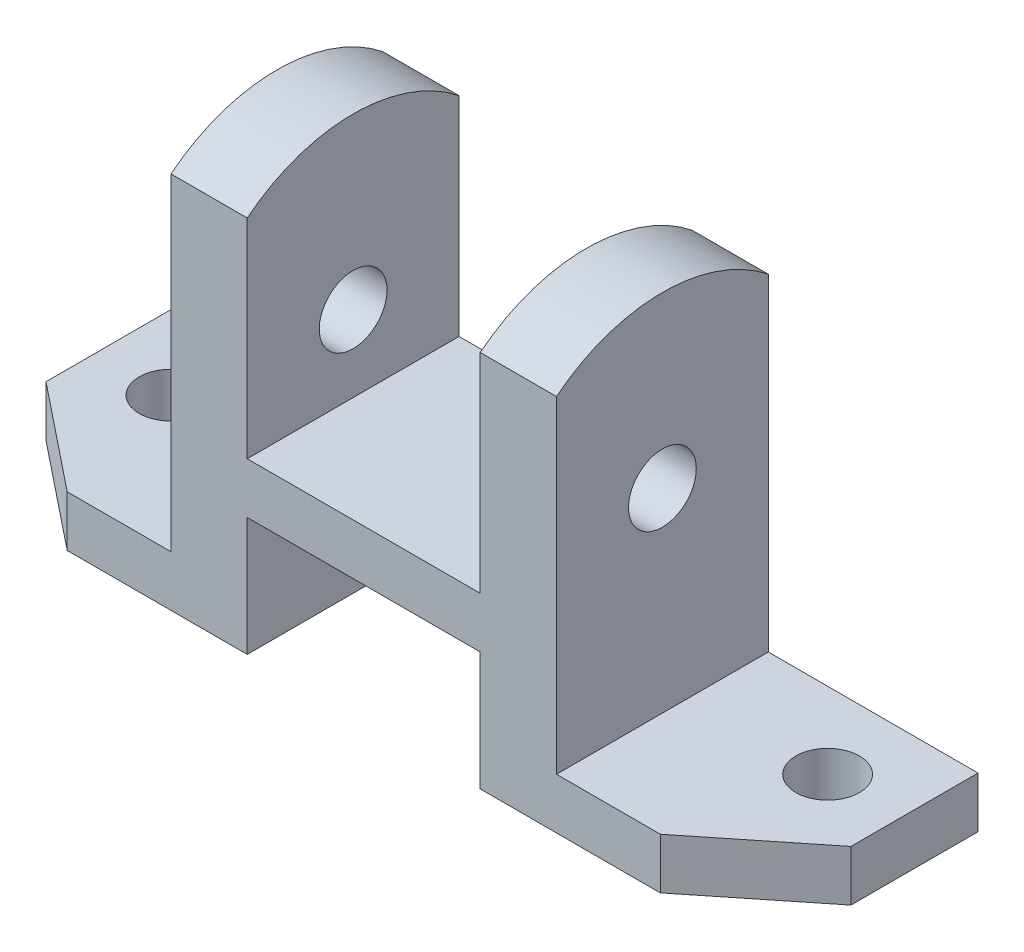
ISO-10303-21;
HEADER;
FILE_DESCRIPTION(('STEP AP214'),'2;1');
FILE_NAME('part.step','',(''),(''),'','','');
FILE_SCHEMA(('AUTOMOTIVE_DESIGN { 1 0 10303 214 1 1 1 1 }'));
ENDSEC;
DATA;
#1=APPLICATION_CONTEXT('core data for automotive mechanical design processes');
#2=APPLICATION_PROTOCOL_DEFINITION('international standard','automotive_design',2000,#1);
#3=PRODUCT_CONTEXT('',#1,'mechanical');
#4=PRODUCT('Part','Part','',(#3));
#5=PRODUCT_RELATED_PRODUCT_CATEGORY('part','',(#4));
#6=PRODUCT_DEFINITION_FORMATION('','',#4);
#7=PRODUCT_DEFINITION_CONTEXT('part definition',#1,'design');
#8=PRODUCT_DEFINITION('design','',#6,#7);
#9=PRODUCT_DEFINITION_SHAPE('','',#8);
#10=(LENGTH_UNIT() NAMED_UNIT(*) SI_UNIT(.MILLI.,.METRE.));
#11=(NAMED_UNIT(*) PLANE_ANGLE_UNIT() SI_UNIT($,.RADIAN.));
#12=(NAMED_UNIT(*) SI_UNIT($,.STERADIAN.) SOLID_ANGLE_UNIT());
#13=UNCERTAINTY_MEASURE_WITH_UNIT(LENGTH_MEASURE(1.E-05),#10,'distance_accuracy_value','');
#14=(GEOMETRIC_REPRESENTATION_CONTEXT(3) GLOBAL_UNCERTAINTY_ASSIGNED_CONTEXT((#13)) GLOBAL_UNIT_ASSIGNED_CONTEXT((#10,
#11,#12)) REPRESENTATION_CONTEXT('',''));
#15=CARTESIAN_POINT('',(0.,0.,0.));
#16=DIRECTION('',(0.,0.,1.));
#17=DIRECTION('',(1.,0.,0.));
#18=AXIS2_PLACEMENT_3D('',#15,#16,#17);
#19=CARTESIAN_POINT('',(27.5,0.,-25.));
#20=DIRECTION('',(-1.,0.,0.));
#21=DIRECTION('',(0.,-1.,0.));
#22=AXIS2_PLACEMENT_3D('',#19,#20,#21);
#23=PLANE('',#22);
#24=CARTESIAN_POINT('',(27.5,58.,0.));
#25=DIRECTION('',(-1.,0.,0.));
#26=DIRECTION('',(0.,-1.,0.));
#27=AXIS2_PLACEMENT_3D('',#24,#25,#26);
#28=CIRCLE('',#27,8.);
#29=CARTESIAN_POINT('',(27.5,50.,0.));
#30=VERTEX_POINT('',#29);
#31=EDGE_CURVE('E426',#30,#30,#28,.T.);
#32=ORIENTED_EDGE('',*,*,#31,.F.);
#33=EDGE_LOOP('',(#32));
#34=FACE_BOUND('',#33,.T.);
#35=CARTESIAN_POINT('',(27.5,58.,0.));
#36=DIRECTION('',(-1.,0.,0.));
#37=DIRECTION('',(0.,-1.,0.));
#38=AXIS2_PLACEMENT_3D('',#35,#36,#37);
#39=CIRCLE('',#38,40.);
#40=CARTESIAN_POINT('',(27.5,89.224989991992,25.));
#41=VERTEX_POINT('',#40);
#42=CARTESIAN_POINT('',(27.5,89.224989991992,-25.));
#43=VERTEX_POINT('',#42);
#44=EDGE_CURVE('E59',#41,#43,#39,.T.);
#45=ORIENTED_EDGE('',*,*,#44,.T.);
#46=DIRECTION('',(0.,-1.,0.));
#47=VECTOR('',#46,1.);
#48=CARTESIAN_POINT('',(27.5,0.,-25.));
#49=LINE('',#48,#47);
#50=CARTESIAN_POINT('',(27.5,40.,-25.));
#51=VERTEX_POINT('',#50);
#52=EDGE_CURVE('E209',#43,#51,#49,.T.);
#53=ORIENTED_EDGE('',*,*,#52,.T.);
#54=DIRECTION('',(0.,0.,1.));
#55=VECTOR('',#54,1.);
#56=CARTESIAN_POINT('',(27.5,40.,-25.));
#57=LINE('',#56,#55);
#58=CARTESIAN_POINT('',(27.5,40.,25.));
#59=VERTEX_POINT('',#58);
#60=EDGE_CURVE('E317',#51,#59,#57,.T.);
#61=ORIENTED_EDGE('',*,*,#60,.T.);
#62=DIRECTION('',(0.,-1.,0.));
#63=VECTOR('',#62,1.);
#64=CARTESIAN_POINT('',(27.5,0.,25.));
#65=LINE('',#64,#63);
#66=EDGE_CURVE('E330',#41,#59,#65,.T.);
#67=ORIENTED_EDGE('',*,*,#66,.F.);
#68=EDGE_LOOP('',(#45,#53,#61,#67));
#69=FACE_BOUND('',#68,.T.);
#70=ADVANCED_FACE('F41',(#34,#69),#23,.T.);
#71=CARTESIAN_POINT('',(-27.5,0.,-25.));
#72=DIRECTION('',(-1.,0.,0.));
#73=DIRECTION('',(0.,-1.,0.));
#74=AXIS2_PLACEMENT_3D('',#71,#72,#73);
#75=PLANE('',#74);
#76=CARTESIAN_POINT('',(-27.5,58.,0.));
#77=DIRECTION('',(-1.,0.,0.));
#78=DIRECTION('',(0.,-1.,0.));
#79=AXIS2_PLACEMENT_3D('',#76,#77,#78);
#80=CIRCLE('',#79,8.);
#81=CARTESIAN_POINT('',(-27.5,50.,0.));
#82=VERTEX_POINT('',#81);
#83=EDGE_CURVE('E429',#82,#82,#80,.T.);
#84=ORIENTED_EDGE('',*,*,#83,.T.);
#85=EDGE_LOOP('',(#84));
#86=FACE_BOUND('',#85,.T.);
#87=DIRECTION('',(0.,-1.,0.));
#88=VECTOR('',#87,1.);
#89=CARTESIAN_POINT('',(-27.5,0.,-25.));
#90=LINE('',#89,#88);
#91=CARTESIAN_POINT('',(-27.5,89.224989991992,-25.));
#92=VERTEX_POINT('',#91);
#93=CARTESIAN_POINT('',(-27.5,40.,-25.));
#94=VERTEX_POINT('',#93);
#95=EDGE_CURVE('E332',#92,#94,#90,.T.);
#96=ORIENTED_EDGE('',*,*,#95,.F.);
#97=CARTESIAN_POINT('',(-27.5,58.,0.));
#98=DIRECTION('',(-1.,0.,0.));
#99=DIRECTION('',(0.,-1.,0.));
#100=AXIS2_PLACEMENT_3D('',#97,#98,#99);
#101=CIRCLE('',#100,40.);
#102=CARTESIAN_POINT('',(-27.5,89.224989991992,25.));
#103=VERTEX_POINT('',#102);
#104=EDGE_CURVE('E432',#103,#92,#101,.T.);
#105=ORIENTED_EDGE('',*,*,#104,.F.);
#106=DIRECTION('',(0.,-1.,0.));
#107=VECTOR('',#106,1.);
#108=CARTESIAN_POINT('',(-27.5,0.,25.));
#109=LINE('',#108,#107);
#110=CARTESIAN_POINT('',(-27.5,40.,25.));
#111=VERTEX_POINT('',#110);
#112=EDGE_CURVE('E324',#103,#111,#109,.T.);
#113=ORIENTED_EDGE('',*,*,#112,.T.);
#114=DIRECTION('',(0.,0.,1.));
#115=VECTOR('',#114,1.);
#116=CARTESIAN_POINT('',(-27.5,40.,-25.));
#117=LINE('',#116,#115);
#118=EDGE_CURVE('E312',#94,#111,#117,.T.);
#119=ORIENTED_EDGE('',*,*,#118,.F.);
#120=EDGE_LOOP('',(#96,#105,#113,#119));
#121=FACE_BOUND('',#120,.T.);
#122=ADVANCED_FACE('F449',(#86,#121),#75,.F.);
#123=CARTESIAN_POINT('',(45.5,0.,-25.));
#124=DIRECTION('',(1.,0.,0.));
#125=DIRECTION('',(0.,0.,-1.));
#126=AXIS2_PLACEMENT_3D('',#123,#124,#125);
#127=PLANE('',#126);
#128=CARTESIAN_POINT('',(45.5,58.,0.));
#129=DIRECTION('',(1.,0.,0.));
#130=DIRECTION('',(0.,0.,-1.));
#131=AXIS2_PLACEMENT_3D('',#128,#129,#130);
#132=CIRCLE('',#131,8.);
#133=CARTESIAN_POINT('',(45.5,58.,-8.));
#134=VERTEX_POINT('',#133);
#135=EDGE_CURVE('E439',#134,#134,#132,.T.);
#136=ORIENTED_EDGE('',*,*,#135,.F.);
#137=EDGE_LOOP('',(#136));
#138=FACE_BOUND('',#137,.T.);
#139=DIRECTION('',(0.,1.,0.));
#140=VECTOR('',#139,1.);
#141=CARTESIAN_POINT('',(45.5,0.,-25.));
#142=LINE('',#141,#140);
#143=CARTESIAN_POINT('',(45.5,12.,-25.));
#144=VERTEX_POINT('',#143);
#145=CARTESIAN_POINT('',(45.5,89.224989991992,-25.));
#146=VERTEX_POINT('',#145);
#147=EDGE_CURVE('E208',#144,#146,#142,.T.);
#148=ORIENTED_EDGE('',*,*,#147,.T.);
#149=CARTESIAN_POINT('',(45.5,58.,0.));
#150=DIRECTION('',(1.,0.,0.));
#151=DIRECTION('',(0.,0.,-1.));
#152=AXIS2_PLACEMENT_3D('',#149,#150,#151);
#153=CIRCLE('',#152,40.);
#154=CARTESIAN_POINT('',(45.5,89.224989991992,25.));
#155=VERTEX_POINT('',#154);
#156=EDGE_CURVE('E188',#146,#155,#153,.T.);
#157=ORIENTED_EDGE('',*,*,#156,.T.);
#158=DIRECTION('',(0.,1.,0.));
#159=VECTOR('',#158,1.);
#160=CARTESIAN_POINT('',(45.5,0.,25.));
#161=LINE('',#160,#159);
#162=CARTESIAN_POINT('',(45.5,12.,25.));
#163=VERTEX_POINT('',#162);
#164=EDGE_CURVE('E218',#163,#155,#161,.T.);
#165=ORIENTED_EDGE('',*,*,#164,.F.);
#166=DIRECTION('',(0.,0.,1.));
#167=VECTOR('',#166,1.);
#168=CARTESIAN_POINT('',(45.5,12.,-25.));
#169=LINE('',#168,#167);
#170=EDGE_CURVE('E212',#144,#163,#169,.T.);
#171=ORIENTED_EDGE('',*,*,#170,.F.);
#172=EDGE_LOOP('',(#148,#157,#165,#171));
#173=FACE_BOUND('',#172,.T.);
#174=ADVANCED_FACE('F213',(#138,#173),#127,.T.);
#175=CARTESIAN_POINT('',(0.,98.,-25.));
#176=DIRECTION('',(0.,0.,-1.));
#177=DIRECTION('',(-1.,0.,0.));
#178=AXIS2_PLACEMENT_3D('',#175,#176,#177);
#179=PLANE('',#178);
#180=DIRECTION('',(0.,1.,0.));
#181=VECTOR('',#180,1.);
#182=CARTESIAN_POINT('',(-45.5,0.,-25.));
#183=LINE('',#182,#181);
#184=CARTESIAN_POINT('',(-45.5,12.,-25.));
#185=VERTEX_POINT('',#184);
#186=CARTESIAN_POINT('',(-45.5,89.224989991992,-25.));
#187=VERTEX_POINT('',#186);
#188=EDGE_CURVE('E277',#185,#187,#183,.T.);
#189=ORIENTED_EDGE('',*,*,#188,.T.);
#190=DIRECTION('',(1.,0.,0.));
#191=VECTOR('',#190,1.);
#192=CARTESIAN_POINT('',(-71.9952977080961,89.224989991992,-25.));
#193=LINE('',#192,#191);
#194=EDGE_CURVE('E203',#187,#92,#193,.T.);
#195=ORIENTED_EDGE('',*,*,#194,.T.);
#196=ORIENTED_EDGE('',*,*,#95,.T.);
#197=DIRECTION('',(1.,0.,0.));
#198=VECTOR('',#197,1.);
#199=CARTESIAN_POINT('',(0.,40.,-25.));
#200=LINE('',#199,#198);
#201=EDGE_CURVE('E318',#94,#51,#200,.T.);
#202=ORIENTED_EDGE('',*,*,#201,.T.);
#203=ORIENTED_EDGE('',*,*,#52,.F.);
#204=EDGE_CURVE('E191',#43,#146,#193,.T.);
#205=ORIENTED_EDGE('',*,*,#204,.T.);
#206=ORIENTED_EDGE('',*,*,#147,.F.);
#207=DIRECTION('',(-1.,0.,0.));
#208=VECTOR('',#207,1.);
#209=CARTESIAN_POINT('',(0.,12.,-25.));
#210=LINE('',#209,#208);
#211=CARTESIAN_POINT('',(95.,12.,-25.));
#212=VERTEX_POINT('',#211);
#213=EDGE_CURVE('E216',#212,#144,#210,.T.);
#214=ORIENTED_EDGE('',*,*,#213,.F.);
#215=DIRECTION('',(0.,-1.,0.));
#216=VECTOR('',#215,1.);
#217=CARTESIAN_POINT('',(95.,98.,-25.));
#218=LINE('',#217,#216);
#219=CARTESIAN_POINT('',(95.,0.,-25.));
#220=VERTEX_POINT('',#219);
#221=EDGE_CURVE('E49',#212,#220,#218,.T.);
#222=ORIENTED_EDGE('',*,*,#221,.T.);
#223=DIRECTION('',(1.,0.,0.));
#224=VECTOR('',#223,1.);
#225=CARTESIAN_POINT('',(0.,0.,-25.));
#226=LINE('',#225,#224);
#227=CARTESIAN_POINT('',(27.5,0.,-25.));
#228=VERTEX_POINT('',#227);
#229=EDGE_CURVE('E240',#228,#220,#226,.T.);
#230=ORIENTED_EDGE('',*,*,#229,.F.);
#231=DIRECTION('',(0.,-1.,0.));
#232=VECTOR('',#231,1.);
#233=CARTESIAN_POINT('',(27.5,28.,-25.));
#234=LINE('',#233,#232);
#235=CARTESIAN_POINT('',(27.5,28.,-25.));
#236=VERTEX_POINT('',#235);
#237=EDGE_CURVE('E301',#236,#228,#234,.T.);
#238=ORIENTED_EDGE('',*,*,#237,.F.);
#239=DIRECTION('',(1.,0.,0.));
#240=VECTOR('',#239,1.);
#241=CARTESIAN_POINT('',(-27.5,28.,-25.));
#242=LINE('',#241,#240);
#243=CARTESIAN_POINT('',(-27.5,28.,-25.));
#244=VERTEX_POINT('',#243);
#245=EDGE_CURVE('E315',#244,#236,#242,.T.);
#246=ORIENTED_EDGE('',*,*,#245,.F.);
#247=DIRECTION('',(0.,-1.,0.));
#248=VECTOR('',#247,1.);
#249=CARTESIAN_POINT('',(-27.5,28.,-25.));
#250=LINE('',#249,#248);
#251=CARTESIAN_POINT('',(-27.5,0.,-25.));
#252=VERTEX_POINT('',#251);
#253=EDGE_CURVE('E283',#244,#252,#250,.T.);
#254=ORIENTED_EDGE('',*,*,#253,.T.);
#255=CARTESIAN_POINT('',(-95.,0.,-25.));
#256=VERTEX_POINT('',#255);
#257=EDGE_CURVE('E236',#256,#252,#226,.T.);
#258=ORIENTED_EDGE('',*,*,#257,.F.);
#259=DIRECTION('',(0.,-1.,0.));
#260=VECTOR('',#259,1.);
#261=CARTESIAN_POINT('',(-95.,98.,-25.));
#262=LINE('',#261,#260);
#263=CARTESIAN_POINT('',(-95.,12.,-25.));
#264=VERTEX_POINT('',#263);
#265=EDGE_CURVE('E263',#264,#256,#262,.T.);
#266=ORIENTED_EDGE('',*,*,#265,.F.);
#267=DIRECTION('',(1.,0.,0.));
#268=VECTOR('',#267,1.);
#269=CARTESIAN_POINT('',(0.,12.,-25.));
#270=LINE('',#269,#268);
#271=EDGE_CURVE('E385',#264,#185,#270,.T.);
#272=ORIENTED_EDGE('',*,*,#271,.T.);
#273=EDGE_LOOP('',(#189,#195,#196,#202,#203,#205,#206,#214,#222,#230,#238,#246,#254,#258,#266,#272));
#274=FACE_BOUND('',#273,.T.);
#275=ADVANCED_FACE('F206',(#274),#179,.T.);
#276=CARTESIAN_POINT('',(0.,98.,25.));
#277=DIRECTION('',(0.,0.,-1.));
#278=DIRECTION('',(-1.,0.,0.));
#279=AXIS2_PLACEMENT_3D('',#276,#277,#278);
#280=PLANE('',#279);
#281=DIRECTION('',(1.,0.,0.));
#282=VECTOR('',#281,1.);
#283=CARTESIAN_POINT('',(-71.9952977080961,89.224989991992,25.));
#284=LINE('',#283,#282);
#285=CARTESIAN_POINT('',(-45.5,89.224989991992,25.));
#286=VERTEX_POINT('',#285);
#287=EDGE_CURVE('E68',#286,#103,#284,.T.);
#288=ORIENTED_EDGE('',*,*,#287,.F.);
#289=DIRECTION('',(0.,1.,0.));
#290=VECTOR('',#289,1.);
#291=CARTESIAN_POINT('',(-45.5,0.,25.));
#292=LINE('',#291,#290);
#293=CARTESIAN_POINT('',(-45.5,12.,25.));
#294=VERTEX_POINT('',#293);
#295=EDGE_CURVE('E276',#294,#286,#292,.T.);
#296=ORIENTED_EDGE('',*,*,#295,.F.);
#297=DIRECTION('',(1.,0.,0.));
#298=VECTOR('',#297,1.);
#299=CARTESIAN_POINT('',(0.,12.,25.));
#300=LINE('',#299,#298);
#301=CARTESIAN_POINT('',(-70.,12.,25.));
#302=VERTEX_POINT('',#301);
#303=EDGE_CURVE('E328',#302,#294,#300,.T.);
#304=ORIENTED_EDGE('',*,*,#303,.F.);
#305=DIRECTION('',(0.,-1.,0.));
#306=VECTOR('',#305,1.);
#307=CARTESIAN_POINT('',(-70.,98.,25.));
#308=LINE('',#307,#306);
#309=CARTESIAN_POINT('',(-70.,0.,25.));
#310=VERTEX_POINT('',#309);
#311=EDGE_CURVE('E259',#302,#310,#308,.T.);
#312=ORIENTED_EDGE('',*,*,#311,.T.);
#313=DIRECTION('',(1.,0.,0.));
#314=VECTOR('',#313,1.);
#315=CARTESIAN_POINT('',(0.,0.,25.));
#316=LINE('',#315,#314);
#317=CARTESIAN_POINT('',(-27.5,0.,25.));
#318=VERTEX_POINT('',#317);
#319=EDGE_CURVE('E246',#310,#318,#316,.T.);
#320=ORIENTED_EDGE('',*,*,#319,.T.);
#321=DIRECTION('',(0.,-1.,0.));
#322=VECTOR('',#321,1.);
#323=CARTESIAN_POINT('',(-27.5,28.,25.));
#324=LINE('',#323,#322);
#325=CARTESIAN_POINT('',(-27.5,28.,25.));
#326=VERTEX_POINT('',#325);
#327=EDGE_CURVE('E296',#326,#318,#324,.T.);
#328=ORIENTED_EDGE('',*,*,#327,.F.);
#329=DIRECTION('',(1.,0.,0.));
#330=VECTOR('',#329,1.);
#331=CARTESIAN_POINT('',(-27.5,28.,25.));
#332=LINE('',#331,#330);
#333=CARTESIAN_POINT('',(27.5,28.,25.));
#334=VERTEX_POINT('',#333);
#335=EDGE_CURVE('E305',#326,#334,#332,.T.);
#336=ORIENTED_EDGE('',*,*,#335,.T.);
#337=DIRECTION('',(0.,-1.,0.));
#338=VECTOR('',#337,1.);
#339=CARTESIAN_POINT('',(27.5,28.,25.));
#340=LINE('',#339,#338);
#341=CARTESIAN_POINT('',(27.5,0.,25.));
#342=VERTEX_POINT('',#341);
#343=EDGE_CURVE('E308',#334,#342,#340,.T.);
#344=ORIENTED_EDGE('',*,*,#343,.T.);
#345=CARTESIAN_POINT('',(69.9999999999999,0.,25.));
#346=VERTEX_POINT('',#345);
#347=EDGE_CURVE('E250',#342,#346,#316,.T.);
#348=ORIENTED_EDGE('',*,*,#347,.T.);
#349=DIRECTION('',(0.,-1.,0.));
#350=VECTOR('',#349,1.);
#351=CARTESIAN_POINT('',(69.9999999999999,98.,25.));
#352=LINE('',#351,#350);
#353=CARTESIAN_POINT('',(69.9999999999999,12.,25.));
#354=VERTEX_POINT('',#353);
#355=EDGE_CURVE('E260',#354,#346,#352,.T.);
#356=ORIENTED_EDGE('',*,*,#355,.F.);
#357=DIRECTION('',(-1.,0.,0.));
#358=VECTOR('',#357,1.);
#359=CARTESIAN_POINT('',(0.,12.,25.));
#360=LINE('',#359,#358);
#361=EDGE_CURVE('E214',#354,#163,#360,.T.);
#362=ORIENTED_EDGE('',*,*,#361,.T.);
#363=ORIENTED_EDGE('',*,*,#164,.T.);
#364=EDGE_CURVE('E198',#41,#155,#284,.T.);
#365=ORIENTED_EDGE('',*,*,#364,.F.);
#366=ORIENTED_EDGE('',*,*,#66,.T.);
#367=DIRECTION('',(1.,0.,0.));
#368=VECTOR('',#367,1.);
#369=CARTESIAN_POINT('',(0.,40.,25.));
#370=LINE('',#369,#368);
#371=EDGE_CURVE('E325',#111,#59,#370,.T.);
#372=ORIENTED_EDGE('',*,*,#371,.F.);
#373=ORIENTED_EDGE('',*,*,#112,.F.);
#374=EDGE_LOOP('',(#288,#296,#304,#312,#320,#328,#336,#344,#348,#356,#362,#363,#365,#366,#372,#373));
#375=FACE_BOUND('',#374,.T.);
#376=ADVANCED_FACE('F340',(#375),#280,.F.);
#377=CARTESIAN_POINT('',(-27.5,28.,-25.));
#378=DIRECTION('',(-1.,0.,0.));
#379=DIRECTION('',(0.,-1.,0.));
#380=AXIS2_PLACEMENT_3D('',#377,#378,#379);
#381=PLANE('',#380);
#382=DIRECTION('',(0.,1.,0.));
#383=VECTOR('',#382,1.);
#384=CARTESIAN_POINT('',(-27.5,-55.578772926361,-11.));
#385=LINE('',#384,#383);
#386=CARTESIAN_POINT('',(-27.5,0.,-11.));
#387=VERTEX_POINT('',#386);
#388=CARTESIAN_POINT('',(-27.5,28.,-11.));
#389=VERTEX_POINT('',#388);
#390=EDGE_CURVE('E416',#387,#389,#385,.T.);
#391=ORIENTED_EDGE('',*,*,#390,.F.);
#392=DIRECTION('',(0.,0.,1.));
#393=VECTOR('',#392,1.);
#394=CARTESIAN_POINT('',(-27.5,0.,-25.));
#395=LINE('',#394,#393);
#396=EDGE_CURVE('E293',#252,#387,#395,.T.);
#397=ORIENTED_EDGE('',*,*,#396,.F.);
#398=ORIENTED_EDGE('',*,*,#253,.F.);
#399=DIRECTION('',(0.,0.,1.));
#400=VECTOR('',#399,1.);
#401=CARTESIAN_POINT('',(-27.5,28.,-25.));
#402=LINE('',#401,#400);
#403=EDGE_CURVE('E292',#244,#389,#402,.T.);
#404=ORIENTED_EDGE('',*,*,#403,.T.);
#405=EDGE_LOOP('',(#391,#397,#398,#404));
#406=FACE_BOUND('',#405,.T.);
#407=ADVANCED_FACE('F371',(#406),#381,.F.);
#408=CARTESIAN_POINT('',(-27.5,28.,-25.));
#409=DIRECTION('',(0.,-1.,0.));
#410=DIRECTION('',(0.,0.,-1.));
#411=AXIS2_PLACEMENT_3D('',#408,#409,#410);
#412=PLANE('',#411);
#413=CARTESIAN_POINT('',(-27.5,28.,-3.00000000000001));
#414=VERTEX_POINT('',#413);
#415=EDGE_CURVE('E294',#414,#326,#402,.T.);
#416=ORIENTED_EDGE('',*,*,#415,.F.);
#417=DIRECTION('',(1.,0.,0.));
#418=VECTOR('',#417,1.);
#419=CARTESIAN_POINT('',(0.,28.,-3.00000000000001));
#420=LINE('',#419,#418);
#421=CARTESIAN_POINT('',(27.5,28.,-3.00000000000001));
#422=VERTEX_POINT('',#421);
#423=EDGE_CURVE('E409',#414,#422,#420,.T.);
#424=ORIENTED_EDGE('',*,*,#423,.T.);
#425=DIRECTION('',(0.,0.,1.));
#426=VECTOR('',#425,1.);
#427=CARTESIAN_POINT('',(27.5,28.,-25.));
#428=LINE('',#427,#426);
#429=EDGE_CURVE('E289',#422,#334,#428,.T.);
#430=ORIENTED_EDGE('',*,*,#429,.T.);
#431=ORIENTED_EDGE('',*,*,#335,.F.);
#432=EDGE_LOOP('',(#416,#424,#430,#431));
#433=FACE_BOUND('',#432,.T.);
#434=ADVANCED_FACE('F403',(#433),#412,.T.);
#435=CARTESIAN_POINT('',(27.5,28.,-25.));
#436=DIRECTION('',(-1.,0.,0.));
#437=DIRECTION('',(0.,-1.,0.));
#438=AXIS2_PLACEMENT_3D('',#435,#436,#437);
#439=PLANE('',#438);
#440=DIRECTION('',(0.,0.,1.));
#441=VECTOR('',#440,1.);
#442=CARTESIAN_POINT('',(27.5,0.,-25.));
#443=LINE('',#442,#441);
#444=CARTESIAN_POINT('',(27.5,0.,-11.));
#445=VERTEX_POINT('',#444);
#446=EDGE_CURVE('E285',#228,#445,#443,.T.);
#447=ORIENTED_EDGE('',*,*,#446,.T.);
#448=DIRECTION('',(0.,1.,0.));
#449=VECTOR('',#448,1.);
#450=CARTESIAN_POINT('',(27.5,-55.578772926361,-11.));
#451=LINE('',#450,#449);
#452=CARTESIAN_POINT('',(27.5,28.,-11.));
#453=VERTEX_POINT('',#452);
#454=EDGE_CURVE('E361',#445,#453,#451,.T.);
#455=ORIENTED_EDGE('',*,*,#454,.T.);
#456=EDGE_CURVE('E290',#236,#453,#428,.T.);
#457=ORIENTED_EDGE('',*,*,#456,.F.);
#458=ORIENTED_EDGE('',*,*,#237,.T.);
#459=EDGE_LOOP('',(#447,#455,#457,#458));
#460=FACE_BOUND('',#459,.T.);
#461=ADVANCED_FACE('F359',(#460),#439,.T.);
#462=CARTESIAN_POINT('',(0.,40.,-25.));
#463=DIRECTION('',(0.,-1.,0.));
#464=DIRECTION('',(0.,0.,-1.));
#465=AXIS2_PLACEMENT_3D('',#462,#463,#464);
#466=PLANE('',#465);
#467=ORIENTED_EDGE('',*,*,#371,.T.);
#468=ORIENTED_EDGE('',*,*,#60,.F.);
#469=ORIENTED_EDGE('',*,*,#201,.F.);
#470=ORIENTED_EDGE('',*,*,#118,.T.);
#471=EDGE_LOOP('',(#467,#468,#469,#470));
#472=FACE_BOUND('',#471,.T.);
#473=ADVANCED_FACE('F452',(#472),#466,.F.);
#474=CARTESIAN_POINT('',(39.5121951219512,98.,49.390243902439));
#475=DIRECTION('',(0.624695047554424,0.,0.780868809443031));
#476=DIRECTION('',(0.780868809443031,0.,-0.624695047554424));
#477=AXIS2_PLACEMENT_3D('',#474,#475,#476);
#478=PLANE('',#477);
#479=DIRECTION('',(0.,-1.,0.));
#480=VECTOR('',#479,1.);
#481=CARTESIAN_POINT('',(95.,98.,4.99999999999997));
#482=LINE('',#481,#480);
#483=CARTESIAN_POINT('',(95.,12.,4.99999999999998));
#484=VERTEX_POINT('',#483);
#485=CARTESIAN_POINT('',(95.,0.,4.99999999999997));
#486=VERTEX_POINT('',#485);
#487=EDGE_CURVE('E11',#484,#486,#482,.T.);
#488=ORIENTED_EDGE('',*,*,#487,.F.);
#489=DIRECTION('',(-0.780868809443031,0.,0.624695047554424));
#490=VECTOR('',#489,1.);
#491=CARTESIAN_POINT('',(39.5121951219512,12.,49.390243902439));
#492=LINE('',#491,#490);
#493=EDGE_CURVE('E221',#484,#354,#492,.T.);
#494=ORIENTED_EDGE('',*,*,#493,.T.);
#495=ORIENTED_EDGE('',*,*,#355,.T.);
#496=DIRECTION('',(-0.780868809443031,0.,0.624695047554424));
#497=VECTOR('',#496,1.);
#498=CARTESIAN_POINT('',(39.5121951219512,0.,49.390243902439));
#499=LINE('',#498,#497);
#500=EDGE_CURVE('E233',#486,#346,#499,.T.);
#501=ORIENTED_EDGE('',*,*,#500,.F.);
#502=EDGE_LOOP('',(#488,#494,#495,#501));
#503=FACE_BOUND('',#502,.T.);
#504=ADVANCED_FACE('F43',(#503),#478,.T.);
#505=CARTESIAN_POINT('',(77.5,98.,-7.00000000000001));
#506=DIRECTION('',(0.,-1.,0.));
#507=DIRECTION('',(0.,0.,-1.));
#508=AXIS2_PLACEMENT_3D('',#505,#506,#507);
#509=CYLINDRICAL_SURFACE('',#508,7.5);
#510=CARTESIAN_POINT('',(77.5,0.,-7.00000000000001));
#511=DIRECTION('',(0.,1.,0.));
#512=DIRECTION('',(0.,0.,1.));
#513=AXIS2_PLACEMENT_3D('',#510,#511,#512);
#514=CIRCLE('',#513,7.5);
#515=CARTESIAN_POINT('',(77.5,0.,0.499999999999986));
#516=VERTEX_POINT('',#515);
#517=EDGE_CURVE('E255',#516,#516,#514,.F.);
#518=ORIENTED_EDGE('',*,*,#517,.T.);
#519=EDGE_LOOP('',(#518));
#520=FACE_BOUND('',#519,.T.);
#521=CARTESIAN_POINT('',(77.5,12.,-7.00000000000001));
#522=DIRECTION('',(0.,1.,0.));
#523=DIRECTION('',(-1.,0.,0.));
#524=AXIS2_PLACEMENT_3D('',#521,#522,#523);
#525=CIRCLE('',#524,7.5);
#526=CARTESIAN_POINT('',(70.,12.,-7.00000000000001));
#527=VERTEX_POINT('',#526);
#528=EDGE_CURVE('E230',#527,#527,#525,.F.);
#529=ORIENTED_EDGE('',*,*,#528,.F.);
#530=EDGE_LOOP('',(#529));
#531=FACE_BOUND('',#530,.T.);
#532=ADVANCED_FACE('F491',(#520,#531),#509,.F.);
#533=CARTESIAN_POINT('',(95.,98.,0.));
#534=DIRECTION('',(-1.,0.,0.));
#535=DIRECTION('',(0.,0.,1.));
#536=AXIS2_PLACEMENT_3D('',#533,#534,#535);
#537=PLANE('',#536);
#538=ORIENTED_EDGE('',*,*,#221,.F.);
#539=DIRECTION('',(0.,0.,1.));
#540=VECTOR('',#539,1.);
#541=CARTESIAN_POINT('',(95.,12.,-25.));
#542=LINE('',#541,#540);
#543=EDGE_CURVE('E310',#212,#484,#542,.T.);
#544=ORIENTED_EDGE('',*,*,#543,.T.);
#545=ORIENTED_EDGE('',*,*,#487,.T.);
#546=DIRECTION('',(0.,0.,-1.));
#547=VECTOR('',#546,1.);
#548=CARTESIAN_POINT('',(95.,0.,0.));
#549=LINE('',#548,#547);
#550=EDGE_CURVE('E232',#486,#220,#549,.T.);
#551=ORIENTED_EDGE('',*,*,#550,.T.);
#552=EDGE_LOOP('',(#538,#544,#545,#551));
#553=FACE_BOUND('',#552,.T.);
#554=ADVANCED_FACE('F346',(#553),#537,.F.);
#555=CARTESIAN_POINT('',(-95.,98.,0.));
#556=DIRECTION('',(-1.,0.,0.));
#557=DIRECTION('',(0.,0.,1.));
#558=AXIS2_PLACEMENT_3D('',#555,#556,#557);
#559=PLANE('',#558);
#560=DIRECTION('',(0.,0.,1.));
#561=VECTOR('',#560,1.);
#562=CARTESIAN_POINT('',(-95.,12.,-25.));
#563=LINE('',#562,#561);
#564=CARTESIAN_POINT('',(-95.,12.,4.99999999999999));
#565=VERTEX_POINT('',#564);
#566=EDGE_CURVE('E269',#264,#565,#563,.T.);
#567=ORIENTED_EDGE('',*,*,#566,.F.);
#568=ORIENTED_EDGE('',*,*,#265,.T.);
#569=DIRECTION('',(0.,0.,-1.));
#570=VECTOR('',#569,1.);
#571=CARTESIAN_POINT('',(-95.,0.,0.));
#572=LINE('',#571,#570);
#573=CARTESIAN_POINT('',(-95.,0.,4.99999999999999));
#574=VERTEX_POINT('',#573);
#575=EDGE_CURVE('E242',#574,#256,#572,.T.);
#576=ORIENTED_EDGE('',*,*,#575,.F.);
#577=DIRECTION('',(0.,-1.,0.));
#578=VECTOR('',#577,1.);
#579=CARTESIAN_POINT('',(-95.,98.,4.99999999999999));
#580=LINE('',#579,#578);
#581=EDGE_CURVE('E261',#565,#574,#580,.T.);
#582=ORIENTED_EDGE('',*,*,#581,.F.);
#583=EDGE_LOOP('',(#567,#568,#576,#582));
#584=FACE_BOUND('',#583,.T.);
#585=ADVANCED_FACE('F379',(#584),#559,.T.);
#586=CARTESIAN_POINT('',(-39.5121951219512,98.,49.390243902439));
#587=DIRECTION('',(0.624695047554424,0.,-0.780868809443031));
#588=DIRECTION('',(-0.780868809443031,0.,-0.624695047554424));
#589=AXIS2_PLACEMENT_3D('',#586,#587,#588);
#590=PLANE('',#589);
#591=ORIENTED_EDGE('',*,*,#311,.F.);
#592=DIRECTION('',(-0.780868809443031,0.,-0.624695047554424));
#593=VECTOR('',#592,1.);
#594=CARTESIAN_POINT('',(-39.5121951219512,12.,49.390243902439));
#595=LINE('',#594,#593);
#596=EDGE_CURVE('E229',#302,#565,#595,.T.);
#597=ORIENTED_EDGE('',*,*,#596,.T.);
#598=ORIENTED_EDGE('',*,*,#581,.T.);
#599=DIRECTION('',(0.780868809443031,0.,0.624695047554424));
#600=VECTOR('',#599,1.);
#601=CARTESIAN_POINT('',(-39.5121951219512,0.,49.390243902439));
#602=LINE('',#601,#600);
#603=EDGE_CURVE('E241',#574,#310,#602,.T.);
#604=ORIENTED_EDGE('',*,*,#603,.T.);
#605=EDGE_LOOP('',(#591,#597,#598,#604));
#606=FACE_BOUND('',#605,.T.);
#607=ADVANCED_FACE('F391',(#606),#590,.F.);
#608=CARTESIAN_POINT('',(-77.5,98.,-7.00000000000001));
#609=DIRECTION('',(0.,-1.,0.));
#610=DIRECTION('',(0.,0.,-1.));
#611=AXIS2_PLACEMENT_3D('',#608,#609,#610);
#612=CYLINDRICAL_SURFACE('',#611,7.5);
#613=CARTESIAN_POINT('',(-77.5,12.,-7.00000000000001));
#614=DIRECTION('',(0.,-1.,0.));
#615=DIRECTION('',(0.,0.,-1.));
#616=AXIS2_PLACEMENT_3D('',#613,#614,#615);
#617=CIRCLE('',#616,7.5);
#618=CARTESIAN_POINT('',(-77.5,12.,-14.5));
#619=VERTEX_POINT('',#618);
#620=EDGE_CURVE('E44',#619,#619,#617,.T.);
#621=ORIENTED_EDGE('',*,*,#620,.F.);
#622=EDGE_LOOP('',(#621));
#623=FACE_BOUND('',#622,.T.);
#624=CARTESIAN_POINT('',(-77.5,0.,-7.00000000000001));
#625=DIRECTION('',(0.,1.,0.));
#626=DIRECTION('',(0.,0.,1.));
#627=AXIS2_PLACEMENT_3D('',#624,#625,#626);
#628=CIRCLE('',#627,7.5);
#629=CARTESIAN_POINT('',(-77.5,0.,0.499999999999986));
#630=VERTEX_POINT('',#629);
#631=EDGE_CURVE('E253',#630,#630,#628,.T.);
#632=ORIENTED_EDGE('',*,*,#631,.F.);
#633=EDGE_LOOP('',(#632));
#634=FACE_BOUND('',#633,.T.);
#635=ADVANCED_FACE('F489',(#623,#634),#612,.F.);
#636=CARTESIAN_POINT('',(0.,0.,0.));
#637=DIRECTION('',(0.,1.,0.));
#638=DIRECTION('',(0.,0.,1.));
#639=AXIS2_PLACEMENT_3D('',#636,#637,#638);
#640=PLANE('',#639);
#641=ORIENTED_EDGE('',*,*,#257,.T.);
#642=ORIENTED_EDGE('',*,*,#396,.T.);
#643=DIRECTION('',(-1.,0.,0.));
#644=VECTOR('',#643,1.);
#645=CARTESIAN_POINT('',(0.,0.,-11.));
#646=LINE('',#645,#644);
#647=EDGE_CURVE('E414',#445,#387,#646,.T.);
#648=ORIENTED_EDGE('',*,*,#647,.F.);
#649=ORIENTED_EDGE('',*,*,#446,.F.);
#650=ORIENTED_EDGE('',*,*,#229,.T.);
#651=ORIENTED_EDGE('',*,*,#550,.F.);
#652=ORIENTED_EDGE('',*,*,#500,.T.);
#653=ORIENTED_EDGE('',*,*,#347,.F.);
#654=CARTESIAN_POINT('',(27.5,0.,-3.00000000000001));
#655=VERTEX_POINT('',#654);
#656=EDGE_CURVE('E288',#655,#342,#443,.T.);
#657=ORIENTED_EDGE('',*,*,#656,.F.);
#658=DIRECTION('',(-1.,0.,0.));
#659=VECTOR('',#658,1.);
#660=CARTESIAN_POINT('',(0.,0.,-3.00000000000001));
#661=LINE('',#660,#659);
#662=CARTESIAN_POINT('',(-27.5,0.,-3.00000000000001));
#663=VERTEX_POINT('',#662);
#664=EDGE_CURVE('E411',#655,#663,#661,.T.);
#665=ORIENTED_EDGE('',*,*,#664,.T.);
#666=EDGE_CURVE('E299',#663,#318,#395,.T.);
#667=ORIENTED_EDGE('',*,*,#666,.T.);
#668=ORIENTED_EDGE('',*,*,#319,.F.);
#669=ORIENTED_EDGE('',*,*,#603,.F.);
#670=ORIENTED_EDGE('',*,*,#575,.T.);
#671=EDGE_LOOP('',(#641,#642,#648,#649,#650,#651,#652,#653,#657,#665,#667,#668,#669,#670));
#672=FACE_BOUND('',#671,.T.);
#673=ORIENTED_EDGE('',*,*,#631,.T.);
#674=EDGE_LOOP('',(#673));
#675=FACE_BOUND('',#674,.T.);
#676=ORIENTED_EDGE('',*,*,#517,.F.);
#677=EDGE_LOOP('',(#676));
#678=FACE_BOUND('',#677,.T.);
#679=ADVANCED_FACE('F352',(#672,#675,#678),#640,.F.);
#680=CARTESIAN_POINT('',(0.,12.,-25.));
#681=DIRECTION('',(0.,1.,0.));
#682=DIRECTION('',(-1.,0.,0.));
#683=AXIS2_PLACEMENT_3D('',#680,#681,#682);
#684=PLANE('',#683);
#685=ORIENTED_EDGE('',*,*,#543,.F.);
#686=ORIENTED_EDGE('',*,*,#213,.T.);
#687=ORIENTED_EDGE('',*,*,#170,.T.);
#688=ORIENTED_EDGE('',*,*,#361,.F.);
#689=ORIENTED_EDGE('',*,*,#493,.F.);
#690=EDGE_LOOP('',(#685,#686,#687,#688,#689));
#691=FACE_BOUND('',#690,.T.);
#692=ORIENTED_EDGE('',*,*,#528,.T.);
#693=EDGE_LOOP('',(#692));
#694=FACE_BOUND('',#693,.T.);
#695=ADVANCED_FACE('F343',(#691,#694),#684,.T.);
#696=ORIENTED_EDGE('',*,*,#666,.F.);
#697=DIRECTION('',(0.,1.,0.));
#698=VECTOR('',#697,1.);
#699=CARTESIAN_POINT('',(-27.5,-55.578772926361,-3.00000000000001));
#700=LINE('',#699,#698);
#701=EDGE_CURVE('E389',#663,#414,#700,.T.);
#702=ORIENTED_EDGE('',*,*,#701,.T.);
#703=ORIENTED_EDGE('',*,*,#415,.T.);
#704=ORIENTED_EDGE('',*,*,#327,.T.);
#705=EDGE_LOOP('',(#696,#702,#703,#704));
#706=FACE_BOUND('',#705,.T.);
#707=ADVANCED_FACE('F397',(#706),#381,.F.);
#708=DIRECTION('',(1.,0.,0.));
#709=VECTOR('',#708,1.);
#710=CARTESIAN_POINT('',(0.,28.,-11.));
#711=LINE('',#710,#709);
#712=EDGE_CURVE('E370',#389,#453,#711,.T.);
#713=ORIENTED_EDGE('',*,*,#712,.F.);
#714=ORIENTED_EDGE('',*,*,#403,.F.);
#715=ORIENTED_EDGE('',*,*,#245,.T.);
#716=ORIENTED_EDGE('',*,*,#456,.T.);
#717=EDGE_LOOP('',(#713,#714,#715,#716));
#718=FACE_BOUND('',#717,.T.);
#719=ADVANCED_FACE('F368',(#718),#412,.T.);
#720=DIRECTION('',(0.,1.,0.));
#721=VECTOR('',#720,1.);
#722=CARTESIAN_POINT('',(27.5,-55.578772926361,-3.00000000000001));
#723=LINE('',#722,#721);
#724=EDGE_CURVE('E423',#655,#422,#723,.T.);
#725=ORIENTED_EDGE('',*,*,#724,.F.);
#726=ORIENTED_EDGE('',*,*,#656,.T.);
#727=ORIENTED_EDGE('',*,*,#343,.F.);
#728=ORIENTED_EDGE('',*,*,#429,.F.);
#729=EDGE_LOOP('',(#725,#726,#727,#728));
#730=FACE_BOUND('',#729,.T.);
#731=ADVANCED_FACE('F413',(#730),#439,.T.);
#732=CARTESIAN_POINT('',(0.,12.,-25.));
#733=DIRECTION('',(0.,-1.,0.));
#734=DIRECTION('',(0.,0.,-1.));
#735=AXIS2_PLACEMENT_3D('',#732,#733,#734);
#736=PLANE('',#735);
#737=ORIENTED_EDGE('',*,*,#620,.T.);
#738=EDGE_LOOP('',(#737));
#739=FACE_BOUND('',#738,.T.);
#740=ORIENTED_EDGE('',*,*,#303,.T.);
#741=DIRECTION('',(0.,0.,1.));
#742=VECTOR('',#741,1.);
#743=CARTESIAN_POINT('',(-45.5,12.,-25.));
#744=LINE('',#743,#742);
#745=EDGE_CURVE('E266',#185,#294,#744,.T.);
#746=ORIENTED_EDGE('',*,*,#745,.F.);
#747=ORIENTED_EDGE('',*,*,#271,.F.);
#748=ORIENTED_EDGE('',*,*,#566,.T.);
#749=ORIENTED_EDGE('',*,*,#596,.F.);
#750=EDGE_LOOP('',(#740,#746,#747,#748,#749));
#751=FACE_BOUND('',#750,.T.);
#752=ADVANCED_FACE('F392',(#739,#751),#736,.F.);
#753=CARTESIAN_POINT('',(-45.5,0.,-25.));
#754=DIRECTION('',(1.,0.,0.));
#755=DIRECTION('',(0.,0.,-1.));
#756=AXIS2_PLACEMENT_3D('',#753,#754,#755);
#757=PLANE('',#756);
#758=CARTESIAN_POINT('',(-45.5,58.,0.));
#759=DIRECTION('',(1.,0.,0.));
#760=DIRECTION('',(0.,0.,-1.));
#761=AXIS2_PLACEMENT_3D('',#758,#759,#760);
#762=CIRCLE('',#761,8.);
#763=CARTESIAN_POINT('',(-45.5,58.,-8.));
#764=VERTEX_POINT('',#763);
#765=EDGE_CURVE('E436',#764,#764,#762,.F.);
#766=ORIENTED_EDGE('',*,*,#765,.F.);
#767=EDGE_LOOP('',(#766));
#768=FACE_BOUND('',#767,.T.);
#769=CARTESIAN_POINT('',(-45.5,58.,0.));
#770=DIRECTION('',(1.,0.,0.));
#771=DIRECTION('',(0.,0.,-1.));
#772=AXIS2_PLACEMENT_3D('',#769,#770,#771);
#773=CIRCLE('',#772,40.);
#774=EDGE_CURVE('E440',#286,#187,#773,.F.);
#775=ORIENTED_EDGE('',*,*,#774,.T.);
#776=ORIENTED_EDGE('',*,*,#188,.F.);
#777=ORIENTED_EDGE('',*,*,#745,.T.);
#778=ORIENTED_EDGE('',*,*,#295,.T.);
#779=EDGE_LOOP('',(#775,#776,#777,#778));
#780=FACE_BOUND('',#779,.T.);
#781=ADVANCED_FACE('F454',(#768,#780),#757,.F.);
#782=CARTESIAN_POINT('',(0.,-55.578772926361,-11.));
#783=DIRECTION('',(0.,0.,1.));
#784=DIRECTION('',(1.,0.,0.));
#785=AXIS2_PLACEMENT_3D('',#782,#783,#784);
#786=PLANE('',#785);
#787=ORIENTED_EDGE('',*,*,#454,.F.);
#788=ORIENTED_EDGE('',*,*,#647,.T.);
#789=ORIENTED_EDGE('',*,*,#390,.T.);
#790=ORIENTED_EDGE('',*,*,#712,.T.);
#791=EDGE_LOOP('',(#787,#788,#789,#790));
#792=FACE_BOUND('',#791,.T.);
#793=ADVANCED_FACE('F586',(#792),#786,.F.);
#794=CARTESIAN_POINT('',(0.,-55.578772926361,-3.00000000000001));
#795=DIRECTION('',(0.,0.,1.));
#796=DIRECTION('',(1.,0.,0.));
#797=AXIS2_PLACEMENT_3D('',#794,#795,#796);
#798=PLANE('',#797);
#799=ORIENTED_EDGE('',*,*,#664,.F.);
#800=ORIENTED_EDGE('',*,*,#724,.T.);
#801=ORIENTED_EDGE('',*,*,#423,.F.);
#802=ORIENTED_EDGE('',*,*,#701,.F.);
#803=EDGE_LOOP('',(#799,#800,#801,#802));
#804=FACE_BOUND('',#803,.T.);
#805=ADVANCED_FACE('F417',(#804),#798,.T.);
#806=CARTESIAN_POINT('',(-71.9952977080961,58.,0.));
#807=DIRECTION('',(1.,0.,0.));
#808=DIRECTION('',(0.,0.,-1.));
#809=AXIS2_PLACEMENT_3D('',#806,#807,#808);
#810=CYLINDRICAL_SURFACE('',#809,8.);
#811=ORIENTED_EDGE('',*,*,#765,.T.);
#812=EDGE_LOOP('',(#811));
#813=FACE_BOUND('',#812,.T.);
#814=ORIENTED_EDGE('',*,*,#83,.F.);
#815=EDGE_LOOP('',(#814));
#816=FACE_BOUND('',#815,.T.);
#817=ADVANCED_FACE('F461',(#813,#816),#810,.F.);
#818=ORIENTED_EDGE('',*,*,#31,.T.);
#819=EDGE_LOOP('',(#818));
#820=FACE_BOUND('',#819,.T.);
#821=ORIENTED_EDGE('',*,*,#135,.T.);
#822=EDGE_LOOP('',(#821));
#823=FACE_BOUND('',#822,.T.);
#824=ADVANCED_FACE('F456',(#820,#823),#810,.F.);
#825=CARTESIAN_POINT('',(-71.9952977080961,58.,0.));
#826=DIRECTION('',(1.,0.,0.));
#827=DIRECTION('',(0.,0.,-1.));
#828=AXIS2_PLACEMENT_3D('',#825,#826,#827);
#829=CYLINDRICAL_SURFACE('',#828,40.);
#830=ORIENTED_EDGE('',*,*,#104,.T.);
#831=ORIENTED_EDGE('',*,*,#194,.F.);
#832=ORIENTED_EDGE('',*,*,#774,.F.);
#833=ORIENTED_EDGE('',*,*,#287,.T.);
#834=EDGE_LOOP('',(#830,#831,#832,#833));
#835=FACE_BOUND('',#834,.T.);
#836=ADVANCED_FACE('F457',(#835),#829,.T.);
#837=ORIENTED_EDGE('',*,*,#364,.T.);
#838=ORIENTED_EDGE('',*,*,#156,.F.);
#839=ORIENTED_EDGE('',*,*,#204,.F.);
#840=ORIENTED_EDGE('',*,*,#44,.F.);
#841=EDGE_LOOP('',(#837,#838,#839,#840));
#842=FACE_BOUND('',#841,.T.);
#843=ADVANCED_FACE('F195',(#842),#829,.T.);
#844=CLOSED_SHELL('',(#70,#122,#174,#275,#376,#407,#434,#461,#473,#504,#532,#554,#585,#607,#635,
#679,#695,#707,#719,#731,#752,#781,#793,#805,#817,#824,#836,#843));
#845=MANIFOLD_SOLID_BREP('B2',#844);
#846=ADVANCED_BREP_SHAPE_REPRESENTATION('',(#18,#845),#14);
#847=SHAPE_DEFINITION_REPRESENTATION(#9,#846);
ENDSEC;
END-ISO-10303-21;
